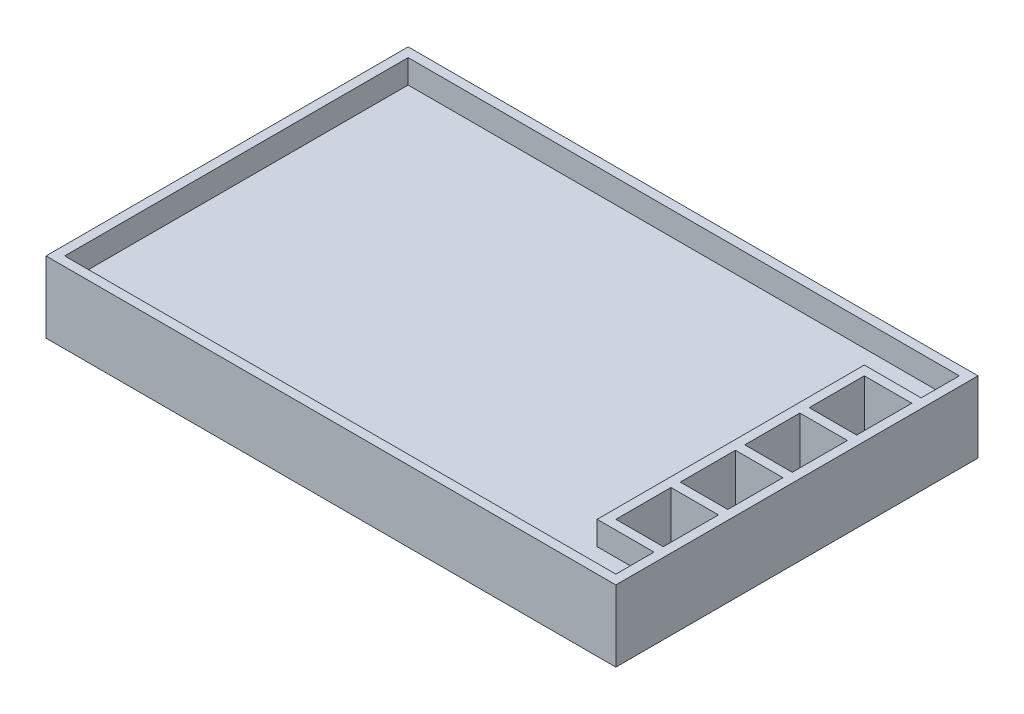
ISO-10303-21;
HEADER;
FILE_DESCRIPTION(('STEP AP214'),'2;1');
FILE_NAME('part.step','',(''),(''),'','','');
FILE_SCHEMA(('AUTOMOTIVE_DESIGN { 1 0 10303 214 1 1 1 1 }'));
ENDSEC;
DATA;
#1=APPLICATION_CONTEXT('core data for automotive mechanical design processes');
#2=APPLICATION_PROTOCOL_DEFINITION('international standard','automotive_design',2000,#1);
#3=PRODUCT_CONTEXT('',#1,'mechanical');
#4=PRODUCT('Part','Part','',(#3));
#5=PRODUCT_RELATED_PRODUCT_CATEGORY('part','',(#4));
#6=PRODUCT_DEFINITION_FORMATION('','',#4);
#7=PRODUCT_DEFINITION_CONTEXT('part definition',#1,'design');
#8=PRODUCT_DEFINITION('design','',#6,#7);
#9=PRODUCT_DEFINITION_SHAPE('','',#8);
#10=(LENGTH_UNIT() NAMED_UNIT(*) SI_UNIT(.MILLI.,.METRE.));
#11=(NAMED_UNIT(*) PLANE_ANGLE_UNIT() SI_UNIT($,.RADIAN.));
#12=(NAMED_UNIT(*) SI_UNIT($,.STERADIAN.) SOLID_ANGLE_UNIT());
#13=UNCERTAINTY_MEASURE_WITH_UNIT(LENGTH_MEASURE(1.E-05),#10,'distance_accuracy_value','');
#14=(GEOMETRIC_REPRESENTATION_CONTEXT(3) GLOBAL_UNCERTAINTY_ASSIGNED_CONTEXT((#13)) GLOBAL_UNIT_ASSIGNED_CONTEXT((#10,
#11,#12)) REPRESENTATION_CONTEXT('',''));
#15=CARTESIAN_POINT('',(0.,0.,0.));
#16=DIRECTION('',(0.,0.,1.));
#17=DIRECTION('',(1.,0.,0.));
#18=AXIS2_PLACEMENT_3D('',#15,#16,#17);
#19=CARTESIAN_POINT('',(327.157180973326,-745.502036847453,-258.416472916478));
#20=DIRECTION('',(1.,0.,0.));
#21=DIRECTION('',(0.,0.,-1.));
#22=AXIS2_PLACEMENT_3D('',#19,#20,#21);
#23=PLANE('',#22);
#24=DIRECTION('',(0.,-1.,0.));
#25=VECTOR('',#24,1.);
#26=CARTESIAN_POINT('',(327.157180973326,292.195619405904,-217.616472916478));
#27=LINE('',#26,#25);
#28=CARTESIAN_POINT('',(327.157180973326,0.,-217.616472916478));
#29=VERTEX_POINT('',#28);
#30=CARTESIAN_POINT('',(327.157180973326,-25.4,-217.616472916478));
#31=VERTEX_POINT('',#30);
#32=EDGE_CURVE('E306',#29,#31,#27,.T.);
#33=ORIENTED_EDGE('',*,*,#32,.F.);
#34=DIRECTION('',(0.,0.,-1.));
#35=VECTOR('',#34,1.);
#36=CARTESIAN_POINT('',(327.157180973326,0.,-258.416472916478));
#37=LINE('',#36,#35);
#38=CARTESIAN_POINT('',(327.157180973326,0.,-258.416472916478));
#39=VERTEX_POINT('',#38);
#40=EDGE_CURVE('E393',#29,#39,#37,.T.);
#41=ORIENTED_EDGE('',*,*,#40,.T.);
#42=DIRECTION('',(0.,1.,0.));
#43=VECTOR('',#42,1.);
#44=CARTESIAN_POINT('',(327.157180973326,-745.502036847453,-258.416472916478));
#45=LINE('',#44,#43);
#46=CARTESIAN_POINT('',(327.157180973326,-25.4,-258.416472916478));
#47=VERTEX_POINT('',#46);
#48=EDGE_CURVE('E410',#47,#39,#45,.T.);
#49=ORIENTED_EDGE('',*,*,#48,.F.);
#50=DIRECTION('',(0.,0.,1.));
#51=VECTOR('',#50,1.);
#52=CARTESIAN_POINT('',(327.157180973326,-25.4,-258.416472916478));
#53=LINE('',#52,#51);
#54=EDGE_CURVE('E375',#47,#31,#53,.T.);
#55=ORIENTED_EDGE('',*,*,#54,.T.);
#56=EDGE_LOOP('',(#33,#41,#49,#55));
#57=FACE_BOUND('',#56,.T.);
#58=ADVANCED_FACE('F38',(#57),#23,.F.);
#59=DIRECTION('',(0.,-1.,0.));
#60=VECTOR('',#59,1.);
#61=CARTESIAN_POINT('',(327.157180973326,292.195619405904,68.1835270835218));
#62=LINE('',#61,#60);
#63=CARTESIAN_POINT('',(327.157180973326,0.,68.1835270835218));
#64=VERTEX_POINT('',#63);
#65=CARTESIAN_POINT('',(327.157180973326,-25.4,68.1835270835218));
#66=VERTEX_POINT('',#65);
#67=EDGE_CURVE('E256',#64,#66,#62,.T.);
#68=ORIENTED_EDGE('',*,*,#67,.T.);
#69=CARTESIAN_POINT('',(327.157180973326,-25.4,108.983527083522));
#70=VERTEX_POINT('',#69);
#71=EDGE_CURVE('E42',#66,#70,#53,.T.);
#72=ORIENTED_EDGE('',*,*,#71,.T.);
#73=DIRECTION('',(0.,1.,0.));
#74=VECTOR('',#73,1.);
#75=CARTESIAN_POINT('',(327.157180973326,-745.502036847453,108.983527083522));
#76=LINE('',#75,#74);
#77=CARTESIAN_POINT('',(327.157180973326,0.,108.983527083522));
#78=VERTEX_POINT('',#77);
#79=EDGE_CURVE('E413',#70,#78,#76,.T.);
#80=ORIENTED_EDGE('',*,*,#79,.T.);
#81=EDGE_CURVE('E398',#78,#64,#37,.T.);
#82=ORIENTED_EDGE('',*,*,#81,.T.);
#83=EDGE_LOOP('',(#68,#72,#80,#82));
#84=FACE_BOUND('',#83,.T.);
#85=ADVANCED_FACE('F462',(#84),#23,.F.);
#86=DIRECTION('',(0.,1.,0.));
#87=VECTOR('',#86,1.);
#88=CARTESIAN_POINT('',(327.157180973326,-154.018651363282,58.1835270835218));
#89=LINE('',#88,#87);
#90=CARTESIAN_POINT('',(327.157180973326,-61.2,58.1835270835218));
#91=VERTEX_POINT('',#90);
#92=CARTESIAN_POINT('',(327.157180973326,0.,58.1835270835217));
#93=VERTEX_POINT('',#92);
#94=EDGE_CURVE('E319',#91,#93,#89,.T.);
#95=ORIENTED_EDGE('',*,*,#94,.T.);
#96=CARTESIAN_POINT('',(327.157180973326,0.,-0.766472916478245));
#97=VERTEX_POINT('',#96);
#98=EDGE_CURVE('E403',#93,#97,#37,.T.);
#99=ORIENTED_EDGE('',*,*,#98,.T.);
#100=DIRECTION('',(0.,1.,0.));
#101=VECTOR('',#100,1.);
#102=CARTESIAN_POINT('',(327.157180973326,-154.018651363282,-0.766472916478259));
#103=LINE('',#102,#101);
#104=CARTESIAN_POINT('',(327.157180973326,-61.2,-0.766472916478259));
#105=VERTEX_POINT('',#104);
#106=EDGE_CURVE('E262',#105,#97,#103,.T.);
#107=ORIENTED_EDGE('',*,*,#106,.F.);
#108=DIRECTION('',(0.,0.,1.));
#109=VECTOR('',#108,1.);
#110=CARTESIAN_POINT('',(327.157180973326,-61.2,-0.766472916478259));
#111=LINE('',#110,#109);
#112=EDGE_CURVE('E321',#105,#91,#111,.T.);
#113=ORIENTED_EDGE('',*,*,#112,.T.);
#114=EDGE_LOOP('',(#95,#99,#107,#113));
#115=FACE_BOUND('',#114,.T.);
#116=ADVANCED_FACE('F468',(#115),#23,.F.);
#117=DIRECTION('',(0.,1.,0.));
#118=VECTOR('',#117,1.);
#119=CARTESIAN_POINT('',(327.157180973326,-154.018651363282,-10.7664729164783));
#120=LINE('',#119,#118);
#121=CARTESIAN_POINT('',(327.157180973326,-61.2,-10.7664729164783));
#122=VERTEX_POINT('',#121);
#123=CARTESIAN_POINT('',(327.157180973326,0.,-10.7664729164783));
#124=VERTEX_POINT('',#123);
#125=EDGE_CURVE('E333',#122,#124,#120,.T.);
#126=ORIENTED_EDGE('',*,*,#125,.T.);
#127=CARTESIAN_POINT('',(327.157180973326,0.,-69.7164729164783));
#128=VERTEX_POINT('',#127);
#129=EDGE_CURVE('E396',#124,#128,#37,.T.);
#130=ORIENTED_EDGE('',*,*,#129,.T.);
#131=DIRECTION('',(0.,1.,0.));
#132=VECTOR('',#131,1.);
#133=CARTESIAN_POINT('',(327.157180973326,-154.018651363282,-69.7164729164783));
#134=LINE('',#133,#132);
#135=CARTESIAN_POINT('',(327.157180973326,-61.2,-69.7164729164783));
#136=VERTEX_POINT('',#135);
#137=EDGE_CURVE('E329',#136,#128,#134,.T.);
#138=ORIENTED_EDGE('',*,*,#137,.F.);
#139=DIRECTION('',(0.,0.,1.));
#140=VECTOR('',#139,1.);
#141=CARTESIAN_POINT('',(327.157180973326,-61.2,-69.7164729164783));
#142=LINE('',#141,#140);
#143=EDGE_CURVE('E335',#136,#122,#142,.T.);
#144=ORIENTED_EDGE('',*,*,#143,.T.);
#145=EDGE_LOOP('',(#126,#130,#138,#144));
#146=FACE_BOUND('',#145,.T.);
#147=ADVANCED_FACE('F482',(#146),#23,.F.);
#148=DIRECTION('',(0.,1.,0.));
#149=VECTOR('',#148,1.);
#150=CARTESIAN_POINT('',(327.157180973326,-154.018651363282,-79.7164729164783));
#151=LINE('',#150,#149);
#152=CARTESIAN_POINT('',(327.157180973326,-61.2,-79.7164729164783));
#153=VERTEX_POINT('',#152);
#154=CARTESIAN_POINT('',(327.157180973326,0.,-79.7164729164783));
#155=VERTEX_POINT('',#154);
#156=EDGE_CURVE('E349',#153,#155,#151,.T.);
#157=ORIENTED_EDGE('',*,*,#156,.T.);
#158=CARTESIAN_POINT('',(327.157180973326,0.,-138.666472916478));
#159=VERTEX_POINT('',#158);
#160=EDGE_CURVE('E392',#155,#159,#37,.T.);
#161=ORIENTED_EDGE('',*,*,#160,.T.);
#162=DIRECTION('',(0.,1.,0.));
#163=VECTOR('',#162,1.);
#164=CARTESIAN_POINT('',(327.157180973326,-154.018651363282,-138.666472916478));
#165=LINE('',#164,#163);
#166=CARTESIAN_POINT('',(327.157180973326,-61.2,-138.666472916478));
#167=VERTEX_POINT('',#166);
#168=EDGE_CURVE('E345',#167,#159,#165,.T.);
#169=ORIENTED_EDGE('',*,*,#168,.F.);
#170=DIRECTION('',(0.,0.,1.));
#171=VECTOR('',#170,1.);
#172=CARTESIAN_POINT('',(327.157180973326,-61.2,-138.666472916478));
#173=LINE('',#172,#171);
#174=EDGE_CURVE('E351',#167,#153,#173,.T.);
#175=ORIENTED_EDGE('',*,*,#174,.T.);
#176=EDGE_LOOP('',(#157,#161,#169,#175));
#177=FACE_BOUND('',#176,.T.);
#178=ADVANCED_FACE('F475',(#177),#23,.F.);
#179=DIRECTION('',(0.,1.,0.));
#180=VECTOR('',#179,1.);
#181=CARTESIAN_POINT('',(327.157180973326,-154.018651363282,-148.666472916478));
#182=LINE('',#181,#180);
#183=CARTESIAN_POINT('',(327.157180973326,-61.2,-148.666472916478));
#184=VERTEX_POINT('',#183);
#185=CARTESIAN_POINT('',(327.157180973326,0.,-148.666472916478));
#186=VERTEX_POINT('',#185);
#187=EDGE_CURVE('E363',#184,#186,#182,.T.);
#188=ORIENTED_EDGE('',*,*,#187,.T.);
#189=CARTESIAN_POINT('',(327.157180973326,0.,-207.616472916478));
#190=VERTEX_POINT('',#189);
#191=EDGE_CURVE('E387',#186,#190,#37,.T.);
#192=ORIENTED_EDGE('',*,*,#191,.T.);
#193=DIRECTION('',(0.,1.,0.));
#194=VECTOR('',#193,1.);
#195=CARTESIAN_POINT('',(327.157180973326,-154.018651363282,-207.616472916478));
#196=LINE('',#195,#194);
#197=CARTESIAN_POINT('',(327.157180973326,-61.2,-207.616472916478));
#198=VERTEX_POINT('',#197);
#199=EDGE_CURVE('E246',#198,#190,#196,.T.);
#200=ORIENTED_EDGE('',*,*,#199,.F.);
#201=DIRECTION('',(0.,0.,1.));
#202=VECTOR('',#201,1.);
#203=CARTESIAN_POINT('',(327.157180973326,-61.2,-207.616472916478));
#204=LINE('',#203,#202);
#205=EDGE_CURVE('E365',#198,#184,#204,.T.);
#206=ORIENTED_EDGE('',*,*,#205,.T.);
#207=EDGE_LOOP('',(#188,#192,#200,#206));
#208=FACE_BOUND('',#207,.T.);
#209=ADVANCED_FACE('F386',(#208),#23,.F.);
#210=CARTESIAN_POINT('',(0.,-25.4,0.));
#211=DIRECTION('',(0.,1.,0.));
#212=DIRECTION('',(0.,0.,1.));
#213=AXIS2_PLACEMENT_3D('',#210,#211,#212);
#214=PLANE('',#213);
#215=DIRECTION('',(0.,0.,1.));
#216=VECTOR('',#215,1.);
#217=CARTESIAN_POINT('',(266.357180973326,-25.4,-217.616472916478));
#218=LINE('',#217,#216);
#219=CARTESIAN_POINT('',(266.357180973326,-25.4,-217.616472916478));
#220=VERTEX_POINT('',#219);
#221=CARTESIAN_POINT('',(266.357180973326,-25.4,68.1835270835218));
#222=VERTEX_POINT('',#221);
#223=EDGE_CURVE('E310',#220,#222,#218,.T.);
#224=ORIENTED_EDGE('',*,*,#223,.F.);
#225=DIRECTION('',(-1.,0.,0.));
#226=VECTOR('',#225,1.);
#227=CARTESIAN_POINT('',(327.157180973326,-25.4,-217.616472916478));
#228=LINE('',#227,#226);
#229=EDGE_CURVE('E269',#31,#220,#228,.T.);
#230=ORIENTED_EDGE('',*,*,#229,.F.);
#231=ORIENTED_EDGE('',*,*,#54,.F.);
#232=DIRECTION('',(1.,0.,0.));
#233=VECTOR('',#232,1.);
#234=CARTESIAN_POINT('',(-262.442819026674,-25.4,-258.416472916478));
#235=LINE('',#234,#233);
#236=CARTESIAN_POINT('',(-262.442819026674,-25.4,-258.416472916478));
#237=VERTEX_POINT('',#236);
#238=EDGE_CURVE('E371',#237,#47,#235,.T.);
#239=ORIENTED_EDGE('',*,*,#238,.F.);
#240=DIRECTION('',(0.,0.,-1.));
#241=VECTOR('',#240,1.);
#242=CARTESIAN_POINT('',(-262.442819026674,-25.4,-258.416472916478));
#243=LINE('',#242,#241);
#244=CARTESIAN_POINT('',(-262.442819026674,-25.4,108.983527083522));
#245=VERTEX_POINT('',#244);
#246=EDGE_CURVE('E419',#245,#237,#243,.T.);
#247=ORIENTED_EDGE('',*,*,#246,.F.);
#248=DIRECTION('',(-1.,0.,0.));
#249=VECTOR('',#248,1.);
#250=CARTESIAN_POINT('',(-262.442819026674,-25.4,108.983527083522));
#251=LINE('',#250,#249);
#252=EDGE_CURVE('E416',#70,#245,#251,.T.);
#253=ORIENTED_EDGE('',*,*,#252,.F.);
#254=ORIENTED_EDGE('',*,*,#71,.F.);
#255=DIRECTION('',(1.,0.,0.));
#256=VECTOR('',#255,1.);
#257=CARTESIAN_POINT('',(266.357180973326,-25.4,68.1835270835218));
#258=LINE('',#257,#256);
#259=EDGE_CURVE('E313',#222,#66,#258,.T.);
#260=ORIENTED_EDGE('',*,*,#259,.F.);
#261=EDGE_LOOP('',(#224,#230,#231,#239,#247,#253,#254,#260));
#262=FACE_BOUND('',#261,.T.);
#263=ADVANCED_FACE('F474',(#262),#214,.T.);
#264=CARTESIAN_POINT('',(-272.442819026674,-76.2,-268.416472916478));
#265=DIRECTION('',(-1.,0.,0.));
#266=DIRECTION('',(0.,0.,1.));
#267=AXIS2_PLACEMENT_3D('',#264,#265,#266);
#268=PLANE('',#267);
#269=DIRECTION('',(0.,0.,1.));
#270=VECTOR('',#269,1.);
#271=CARTESIAN_POINT('',(-272.442819026674,0.,-268.416472916478));
#272=LINE('',#271,#270);
#273=CARTESIAN_POINT('',(-272.442819026674,0.,-268.416472916478));
#274=VERTEX_POINT('',#273);
#275=CARTESIAN_POINT('',(-272.442819026674,0.,118.983527083522));
#276=VERTEX_POINT('',#275);
#277=EDGE_CURVE('E418',#274,#276,#272,.T.);
#278=ORIENTED_EDGE('',*,*,#277,.F.);
#279=DIRECTION('',(0.,1.,0.));
#280=VECTOR('',#279,1.);
#281=CARTESIAN_POINT('',(-272.442819026674,-76.2,-268.416472916478));
#282=LINE('',#281,#280);
#283=CARTESIAN_POINT('',(-272.442819026674,-76.2,-268.416472916478));
#284=VERTEX_POINT('',#283);
#285=EDGE_CURVE('E12',#284,#274,#282,.T.);
#286=ORIENTED_EDGE('',*,*,#285,.F.);
#287=DIRECTION('',(0.,0.,1.));
#288=VECTOR('',#287,1.);
#289=CARTESIAN_POINT('',(-272.442819026674,-76.2,-268.416472916478));
#290=LINE('',#289,#288);
#291=CARTESIAN_POINT('',(-272.442819026674,-76.2,118.983527083522));
#292=VERTEX_POINT('',#291);
#293=EDGE_CURVE('E420',#284,#292,#290,.T.);
#294=ORIENTED_EDGE('',*,*,#293,.T.);
#295=DIRECTION('',(0.,1.,0.));
#296=VECTOR('',#295,1.);
#297=CARTESIAN_POINT('',(-272.442819026674,-76.2,118.983527083522));
#298=LINE('',#297,#296);
#299=EDGE_CURVE('E89',#292,#276,#298,.T.);
#300=ORIENTED_EDGE('',*,*,#299,.T.);
#301=EDGE_LOOP('',(#278,#286,#294,#300));
#302=FACE_BOUND('',#301,.T.);
#303=ADVANCED_FACE('F40',(#302),#268,.T.);
#304=CARTESIAN_POINT('',(-272.442819026674,-76.2,-268.416472916478));
#305=DIRECTION('',(0.,0.,-1.));
#306=DIRECTION('',(-1.,0.,0.));
#307=AXIS2_PLACEMENT_3D('',#304,#305,#306);
#308=PLANE('',#307);
#309=DIRECTION('',(-1.,0.,0.));
#310=VECTOR('',#309,1.);
#311=CARTESIAN_POINT('',(-272.442819026674,0.,-268.416472916478));
#312=LINE('',#311,#310);
#313=CARTESIAN_POINT('',(337.157180973326,0.,-268.416472916478));
#314=VERTEX_POINT('',#313);
#315=EDGE_CURVE('E423',#314,#274,#312,.T.);
#316=ORIENTED_EDGE('',*,*,#315,.F.);
#317=DIRECTION('',(0.,1.,0.));
#318=VECTOR('',#317,1.);
#319=CARTESIAN_POINT('',(337.157180973326,-76.2,-268.416472916478));
#320=LINE('',#319,#318);
#321=CARTESIAN_POINT('',(337.157180973326,-76.2,-268.416472916478));
#322=VERTEX_POINT('',#321);
#323=EDGE_CURVE('E48',#322,#314,#320,.T.);
#324=ORIENTED_EDGE('',*,*,#323,.F.);
#325=DIRECTION('',(-1.,0.,0.));
#326=VECTOR('',#325,1.);
#327=CARTESIAN_POINT('',(-272.442819026674,-76.2,-268.416472916478));
#328=LINE('',#327,#326);
#329=EDGE_CURVE('E428',#322,#284,#328,.T.);
#330=ORIENTED_EDGE('',*,*,#329,.T.);
#331=ORIENTED_EDGE('',*,*,#285,.T.);
#332=EDGE_LOOP('',(#316,#324,#330,#331));
#333=FACE_BOUND('',#332,.T.);
#334=ADVANCED_FACE('F444',(#333),#308,.T.);
#335=CARTESIAN_POINT('',(337.157180973326,-76.2,-268.416472916478));
#336=DIRECTION('',(1.,0.,0.));
#337=DIRECTION('',(0.,0.,-1.));
#338=AXIS2_PLACEMENT_3D('',#335,#336,#337);
#339=PLANE('',#338);
#340=DIRECTION('',(0.,0.,-1.));
#341=VECTOR('',#340,1.);
#342=CARTESIAN_POINT('',(337.157180973326,0.,-268.416472916478));
#343=LINE('',#342,#341);
#344=CARTESIAN_POINT('',(337.157180973326,0.,118.983527083522));
#345=VERTEX_POINT('',#344);
#346=EDGE_CURVE('E435',#345,#314,#343,.T.);
#347=ORIENTED_EDGE('',*,*,#346,.F.);
#348=DIRECTION('',(0.,1.,0.));
#349=VECTOR('',#348,1.);
#350=CARTESIAN_POINT('',(337.157180973326,-76.2,118.983527083522));
#351=LINE('',#350,#349);
#352=CARTESIAN_POINT('',(337.157180973326,-76.2,118.983527083522));
#353=VERTEX_POINT('',#352);
#354=EDGE_CURVE('E440',#353,#345,#351,.T.);
#355=ORIENTED_EDGE('',*,*,#354,.F.);
#356=DIRECTION('',(0.,0.,-1.));
#357=VECTOR('',#356,1.);
#358=CARTESIAN_POINT('',(337.157180973326,-76.2,-268.416472916478));
#359=LINE('',#358,#357);
#360=EDGE_CURVE('E425',#353,#322,#359,.T.);
#361=ORIENTED_EDGE('',*,*,#360,.T.);
#362=ORIENTED_EDGE('',*,*,#323,.T.);
#363=EDGE_LOOP('',(#347,#355,#361,#362));
#364=FACE_BOUND('',#363,.T.);
#365=ADVANCED_FACE('F448',(#364),#339,.T.);
#366=CARTESIAN_POINT('',(-272.442819026674,-76.2,118.983527083522));
#367=DIRECTION('',(0.,0.,1.));
#368=DIRECTION('',(1.,0.,0.));
#369=AXIS2_PLACEMENT_3D('',#366,#367,#368);
#370=PLANE('',#369);
#371=DIRECTION('',(1.,0.,0.));
#372=VECTOR('',#371,1.);
#373=CARTESIAN_POINT('',(-272.442819026674,0.,118.983527083522));
#374=LINE('',#373,#372);
#375=EDGE_CURVE('E432',#276,#345,#374,.T.);
#376=ORIENTED_EDGE('',*,*,#375,.F.);
#377=ORIENTED_EDGE('',*,*,#299,.F.);
#378=DIRECTION('',(1.,0.,0.));
#379=VECTOR('',#378,1.);
#380=CARTESIAN_POINT('',(-272.442819026674,-76.2,118.983527083522));
#381=LINE('',#380,#379);
#382=EDGE_CURVE('E422',#292,#353,#381,.T.);
#383=ORIENTED_EDGE('',*,*,#382,.T.);
#384=ORIENTED_EDGE('',*,*,#354,.T.);
#385=EDGE_LOOP('',(#376,#377,#383,#384));
#386=FACE_BOUND('',#385,.T.);
#387=ADVANCED_FACE('F442',(#386),#370,.T.);
#388=CARTESIAN_POINT('',(0.,-76.2,0.));
#389=DIRECTION('',(0.,1.,0.));
#390=DIRECTION('',(0.,0.,1.));
#391=AXIS2_PLACEMENT_3D('',#388,#389,#390);
#392=PLANE('',#391);
#393=ORIENTED_EDGE('',*,*,#293,.F.);
#394=ORIENTED_EDGE('',*,*,#329,.F.);
#395=ORIENTED_EDGE('',*,*,#360,.F.);
#396=ORIENTED_EDGE('',*,*,#382,.F.);
#397=EDGE_LOOP('',(#393,#394,#395,#396));
#398=FACE_BOUND('',#397,.T.);
#399=ADVANCED_FACE('F450',(#398),#392,.F.);
#400=CARTESIAN_POINT('',(0.,0.,0.));
#401=DIRECTION('',(0.,1.,0.));
#402=DIRECTION('',(0.,0.,1.));
#403=AXIS2_PLACEMENT_3D('',#400,#401,#402);
#404=PLANE('',#403);
#405=ORIENTED_EDGE('',*,*,#40,.F.);
#406=DIRECTION('',(-1.,0.,0.));
#407=VECTOR('',#406,1.);
#408=CARTESIAN_POINT('',(327.157180973326,0.,-217.616472916478));
#409=LINE('',#408,#407);
#410=CARTESIAN_POINT('',(266.357180973326,0.,-217.616472916478));
#411=VERTEX_POINT('',#410);
#412=EDGE_CURVE('E255',#29,#411,#409,.T.);
#413=ORIENTED_EDGE('',*,*,#412,.T.);
#414=DIRECTION('',(0.,0.,1.));
#415=VECTOR('',#414,1.);
#416=CARTESIAN_POINT('',(266.357180973326,0.,-217.616472916478));
#417=LINE('',#416,#415);
#418=CARTESIAN_POINT('',(266.357180973326,0.,68.1835270835218));
#419=VERTEX_POINT('',#418);
#420=EDGE_CURVE('E301',#411,#419,#417,.T.);
#421=ORIENTED_EDGE('',*,*,#420,.T.);
#422=DIRECTION('',(1.,0.,0.));
#423=VECTOR('',#422,1.);
#424=CARTESIAN_POINT('',(266.357180973326,0.,68.1835270835218));
#425=LINE('',#424,#423);
#426=EDGE_CURVE('E298',#419,#64,#425,.T.);
#427=ORIENTED_EDGE('',*,*,#426,.T.);
#428=ORIENTED_EDGE('',*,*,#81,.F.);
#429=DIRECTION('',(1.,0.,0.));
#430=VECTOR('',#429,1.);
#431=CARTESIAN_POINT('',(-262.442819026674,0.,108.983527083522));
#432=LINE('',#431,#430);
#433=CARTESIAN_POINT('',(-262.442819026674,0.,108.983527083522));
#434=VERTEX_POINT('',#433);
#435=EDGE_CURVE('E397',#434,#78,#432,.T.);
#436=ORIENTED_EDGE('',*,*,#435,.F.);
#437=DIRECTION('',(0.,0.,1.));
#438=VECTOR('',#437,1.);
#439=CARTESIAN_POINT('',(-262.442819026674,0.,-258.416472916478));
#440=LINE('',#439,#438);
#441=CARTESIAN_POINT('',(-262.442819026674,0.,-258.416472916478));
#442=VERTEX_POINT('',#441);
#443=EDGE_CURVE('E56',#442,#434,#440,.T.);
#444=ORIENTED_EDGE('',*,*,#443,.F.);
#445=DIRECTION('',(-1.,0.,0.));
#446=VECTOR('',#445,1.);
#447=CARTESIAN_POINT('',(-262.442819026674,0.,-258.416472916478));
#448=LINE('',#447,#446);
#449=EDGE_CURVE('E402',#39,#442,#448,.T.);
#450=ORIENTED_EDGE('',*,*,#449,.F.);
#451=EDGE_LOOP('',(#405,#413,#421,#427,#428,#436,#444,#450));
#452=FACE_BOUND('',#451,.T.);
#453=ORIENTED_EDGE('',*,*,#191,.F.);
#454=DIRECTION('',(-1.,0.,0.));
#455=VECTOR('',#454,1.);
#456=CARTESIAN_POINT('',(327.157180973326,0.,-148.666472916478));
#457=LINE('',#456,#455);
#458=CARTESIAN_POINT('',(276.357180973326,0.,-148.666472916478));
#459=VERTEX_POINT('',#458);
#460=EDGE_CURVE('E261',#186,#459,#457,.T.);
#461=ORIENTED_EDGE('',*,*,#460,.T.);
#462=DIRECTION('',(0.,0.,-1.));
#463=VECTOR('',#462,1.);
#464=CARTESIAN_POINT('',(276.357180973326,0.,-148.666472916478));
#465=LINE('',#464,#463);
#466=CARTESIAN_POINT('',(276.357180973326,0.,-207.616472916478));
#467=VERTEX_POINT('',#466);
#468=EDGE_CURVE('E239',#459,#467,#465,.T.);
#469=ORIENTED_EDGE('',*,*,#468,.T.);
#470=DIRECTION('',(1.,0.,0.));
#471=VECTOR('',#470,1.);
#472=CARTESIAN_POINT('',(276.357180973326,0.,-207.616472916478));
#473=LINE('',#472,#471);
#474=EDGE_CURVE('E249',#467,#190,#473,.T.);
#475=ORIENTED_EDGE('',*,*,#474,.T.);
#476=EDGE_LOOP('',(#453,#461,#469,#475));
#477=FACE_BOUND('',#476,.T.);
#478=ORIENTED_EDGE('',*,*,#160,.F.);
#479=DIRECTION('',(-1.,0.,0.));
#480=VECTOR('',#479,1.);
#481=CARTESIAN_POINT('',(327.157180973326,0.,-79.7164729164783));
#482=LINE('',#481,#480);
#483=CARTESIAN_POINT('',(276.357180973326,0.,-79.7164729164783));
#484=VERTEX_POINT('',#483);
#485=EDGE_CURVE('E277',#155,#484,#482,.T.);
#486=ORIENTED_EDGE('',*,*,#485,.T.);
#487=DIRECTION('',(0.,0.,-1.));
#488=VECTOR('',#487,1.);
#489=CARTESIAN_POINT('',(276.357180973326,0.,-79.7164729164783));
#490=LINE('',#489,#488);
#491=CARTESIAN_POINT('',(276.357180973326,0.,-138.666472916478));
#492=VERTEX_POINT('',#491);
#493=EDGE_CURVE('E274',#484,#492,#490,.T.);
#494=ORIENTED_EDGE('',*,*,#493,.T.);
#495=DIRECTION('',(1.,0.,0.));
#496=VECTOR('',#495,1.);
#497=CARTESIAN_POINT('',(276.357180973326,0.,-138.666472916478));
#498=LINE('',#497,#496);
#499=EDGE_CURVE('E266',#492,#159,#498,.T.);
#500=ORIENTED_EDGE('',*,*,#499,.T.);
#501=EDGE_LOOP('',(#478,#486,#494,#500));
#502=FACE_BOUND('',#501,.T.);
#503=ORIENTED_EDGE('',*,*,#129,.F.);
#504=DIRECTION('',(-1.,0.,0.));
#505=VECTOR('',#504,1.);
#506=CARTESIAN_POINT('',(327.157180973326,0.,-10.7664729164783));
#507=LINE('',#506,#505);
#508=CARTESIAN_POINT('',(276.357180973326,0.,-10.7664729164783));
#509=VERTEX_POINT('',#508);
#510=EDGE_CURVE('E286',#124,#509,#507,.T.);
#511=ORIENTED_EDGE('',*,*,#510,.T.);
#512=DIRECTION('',(0.,0.,-1.));
#513=VECTOR('',#512,1.);
#514=CARTESIAN_POINT('',(276.357180973326,0.,-10.7664729164783));
#515=LINE('',#514,#513);
#516=CARTESIAN_POINT('',(276.357180973326,0.,-69.7164729164783));
#517=VERTEX_POINT('',#516);
#518=EDGE_CURVE('E283',#509,#517,#515,.T.);
#519=ORIENTED_EDGE('',*,*,#518,.T.);
#520=DIRECTION('',(1.,0.,0.));
#521=VECTOR('',#520,1.);
#522=CARTESIAN_POINT('',(276.357180973326,0.,-69.7164729164783));
#523=LINE('',#522,#521);
#524=EDGE_CURVE('E280',#517,#128,#523,.T.);
#525=ORIENTED_EDGE('',*,*,#524,.T.);
#526=EDGE_LOOP('',(#503,#511,#519,#525));
#527=FACE_BOUND('',#526,.T.);
#528=DIRECTION('',(1.,0.,0.));
#529=VECTOR('',#528,1.);
#530=CARTESIAN_POINT('',(276.357180973326,0.,-0.766472916478254));
#531=LINE('',#530,#529);
#532=CARTESIAN_POINT('',(276.357180973326,0.,-0.766472916478254));
#533=VERTEX_POINT('',#532);
#534=EDGE_CURVE('E289',#533,#97,#531,.T.);
#535=ORIENTED_EDGE('',*,*,#534,.T.);
#536=ORIENTED_EDGE('',*,*,#98,.F.);
#537=DIRECTION('',(-1.,0.,0.));
#538=VECTOR('',#537,1.);
#539=CARTESIAN_POINT('',(327.157180973326,0.,58.1835270835217));
#540=LINE('',#539,#538);
#541=CARTESIAN_POINT('',(276.357180973326,0.,58.1835270835217));
#542=VERTEX_POINT('',#541);
#543=EDGE_CURVE('E295',#93,#542,#540,.T.);
#544=ORIENTED_EDGE('',*,*,#543,.T.);
#545=DIRECTION('',(0.,0.,-1.));
#546=VECTOR('',#545,1.);
#547=CARTESIAN_POINT('',(276.357180973326,0.,58.1835270835217));
#548=LINE('',#547,#546);
#549=EDGE_CURVE('E292',#542,#533,#548,.T.);
#550=ORIENTED_EDGE('',*,*,#549,.T.);
#551=EDGE_LOOP('',(#535,#536,#544,#550));
#552=FACE_BOUND('',#551,.T.);
#553=ORIENTED_EDGE('',*,*,#277,.T.);
#554=ORIENTED_EDGE('',*,*,#375,.T.);
#555=ORIENTED_EDGE('',*,*,#346,.T.);
#556=ORIENTED_EDGE('',*,*,#315,.T.);
#557=EDGE_LOOP('',(#553,#554,#555,#556));
#558=FACE_BOUND('',#557,.T.);
#559=ADVANCED_FACE('F258',(#452,#477,#502,#527,#552,#558),#404,.T.);
#560=CARTESIAN_POINT('',(-262.442819026674,-745.502036847453,-258.416472916478));
#561=DIRECTION('',(-1.,0.,0.));
#562=DIRECTION('',(0.,0.,1.));
#563=AXIS2_PLACEMENT_3D('',#560,#561,#562);
#564=PLANE('',#563);
#565=ORIENTED_EDGE('',*,*,#246,.T.);
#566=DIRECTION('',(0.,1.,0.));
#567=VECTOR('',#566,1.);
#568=CARTESIAN_POINT('',(-262.442819026674,-745.502036847453,-258.416472916478));
#569=LINE('',#568,#567);
#570=EDGE_CURVE('E408',#237,#442,#569,.T.);
#571=ORIENTED_EDGE('',*,*,#570,.T.);
#572=ORIENTED_EDGE('',*,*,#443,.T.);
#573=DIRECTION('',(0.,1.,0.));
#574=VECTOR('',#573,1.);
#575=CARTESIAN_POINT('',(-262.442819026674,-745.502036847453,108.983527083522));
#576=LINE('',#575,#574);
#577=EDGE_CURVE('E407',#245,#434,#576,.T.);
#578=ORIENTED_EDGE('',*,*,#577,.F.);
#579=EDGE_LOOP('',(#565,#571,#572,#578));
#580=FACE_BOUND('',#579,.T.);
#581=ADVANCED_FACE('F457',(#580),#564,.F.);
#582=CARTESIAN_POINT('',(-262.442819026674,-745.502036847453,-258.416472916478));
#583=DIRECTION('',(0.,0.,-1.));
#584=DIRECTION('',(-1.,0.,0.));
#585=AXIS2_PLACEMENT_3D('',#582,#583,#584);
#586=PLANE('',#585);
#587=ORIENTED_EDGE('',*,*,#238,.T.);
#588=ORIENTED_EDGE('',*,*,#48,.T.);
#589=ORIENTED_EDGE('',*,*,#449,.T.);
#590=ORIENTED_EDGE('',*,*,#570,.F.);
#591=EDGE_LOOP('',(#587,#588,#589,#590));
#592=FACE_BOUND('',#591,.T.);
#593=ADVANCED_FACE('F529',(#592),#586,.F.);
#594=CARTESIAN_POINT('',(-262.442819026674,-745.502036847453,108.983527083522));
#595=DIRECTION('',(0.,0.,1.));
#596=DIRECTION('',(1.,0.,0.));
#597=AXIS2_PLACEMENT_3D('',#594,#595,#596);
#598=PLANE('',#597);
#599=ORIENTED_EDGE('',*,*,#252,.T.);
#600=ORIENTED_EDGE('',*,*,#577,.T.);
#601=ORIENTED_EDGE('',*,*,#435,.T.);
#602=ORIENTED_EDGE('',*,*,#79,.F.);
#603=EDGE_LOOP('',(#599,#600,#601,#602));
#604=FACE_BOUND('',#603,.T.);
#605=ADVANCED_FACE('F525',(#604),#598,.F.);
#606=CARTESIAN_POINT('',(327.157180973326,-154.018651363282,-148.666472916478));
#607=DIRECTION('',(0.,0.,1.));
#608=DIRECTION('',(1.,0.,0.));
#609=AXIS2_PLACEMENT_3D('',#606,#607,#608);
#610=PLANE('',#609);
#611=DIRECTION('',(-1.,0.,0.));
#612=VECTOR('',#611,1.);
#613=CARTESIAN_POINT('',(327.157180973326,-61.2,-148.666472916478));
#614=LINE('',#613,#612);
#615=CARTESIAN_POINT('',(276.357180973326,-61.2,-148.666472916478));
#616=VERTEX_POINT('',#615);
#617=EDGE_CURVE('E362',#184,#616,#614,.T.);
#618=ORIENTED_EDGE('',*,*,#617,.T.);
#619=DIRECTION('',(0.,1.,0.));
#620=VECTOR('',#619,1.);
#621=CARTESIAN_POINT('',(276.357180973326,-154.018651363282,-148.666472916478));
#622=LINE('',#621,#620);
#623=EDGE_CURVE('E245',#616,#459,#622,.T.);
#624=ORIENTED_EDGE('',*,*,#623,.T.);
#625=ORIENTED_EDGE('',*,*,#460,.F.);
#626=ORIENTED_EDGE('',*,*,#187,.F.);
#627=EDGE_LOOP('',(#618,#624,#625,#626));
#628=FACE_BOUND('',#627,.T.);
#629=ADVANCED_FACE('F391',(#628),#610,.F.);
#630=CARTESIAN_POINT('',(276.357180973326,-154.018651363282,-207.616472916478));
#631=DIRECTION('',(-1.,0.,0.));
#632=DIRECTION('',(0.,0.,1.));
#633=AXIS2_PLACEMENT_3D('',#630,#631,#632);
#634=PLANE('',#633);
#635=DIRECTION('',(0.,0.,-1.));
#636=VECTOR('',#635,1.);
#637=CARTESIAN_POINT('',(276.357180973326,-61.2,-207.616472916478));
#638=LINE('',#637,#636);
#639=CARTESIAN_POINT('',(276.357180973326,-61.2,-207.616472916478));
#640=VERTEX_POINT('',#639);
#641=EDGE_CURVE('E242',#616,#640,#638,.T.);
#642=ORIENTED_EDGE('',*,*,#641,.T.);
#643=DIRECTION('',(0.,1.,0.));
#644=VECTOR('',#643,1.);
#645=CARTESIAN_POINT('',(276.357180973326,-154.018651363282,-207.616472916478));
#646=LINE('',#645,#644);
#647=EDGE_CURVE('E234',#640,#467,#646,.T.);
#648=ORIENTED_EDGE('',*,*,#647,.T.);
#649=ORIENTED_EDGE('',*,*,#468,.F.);
#650=ORIENTED_EDGE('',*,*,#623,.F.);
#651=EDGE_LOOP('',(#642,#648,#649,#650));
#652=FACE_BOUND('',#651,.T.);
#653=ADVANCED_FACE('F236',(#652),#634,.F.);
#654=CARTESIAN_POINT('',(327.157180973326,-154.018651363282,-207.616472916478));
#655=DIRECTION('',(0.,0.,-1.));
#656=DIRECTION('',(-1.,0.,0.));
#657=AXIS2_PLACEMENT_3D('',#654,#655,#656);
#658=PLANE('',#657);
#659=DIRECTION('',(1.,0.,0.));
#660=VECTOR('',#659,1.);
#661=CARTESIAN_POINT('',(327.157180973326,-61.2,-207.616472916478));
#662=LINE('',#661,#660);
#663=EDGE_CURVE('E367',#640,#198,#662,.T.);
#664=ORIENTED_EDGE('',*,*,#663,.T.);
#665=ORIENTED_EDGE('',*,*,#199,.T.);
#666=ORIENTED_EDGE('',*,*,#474,.F.);
#667=ORIENTED_EDGE('',*,*,#647,.F.);
#668=EDGE_LOOP('',(#664,#665,#666,#667));
#669=FACE_BOUND('',#668,.T.);
#670=ADVANCED_FACE('F250',(#669),#658,.F.);
#671=CARTESIAN_POINT('',(0.,-61.2,0.));
#672=DIRECTION('',(0.,1.,0.));
#673=DIRECTION('',(0.,0.,1.));
#674=AXIS2_PLACEMENT_3D('',#671,#672,#673);
#675=PLANE('',#674);
#676=ORIENTED_EDGE('',*,*,#205,.F.);
#677=ORIENTED_EDGE('',*,*,#663,.F.);
#678=ORIENTED_EDGE('',*,*,#641,.F.);
#679=ORIENTED_EDGE('',*,*,#617,.F.);
#680=EDGE_LOOP('',(#676,#677,#678,#679));
#681=FACE_BOUND('',#680,.T.);
#682=ADVANCED_FACE('F516',(#681),#675,.T.);
#683=CARTESIAN_POINT('',(327.157180973326,-154.018651363282,-79.7164729164783));
#684=DIRECTION('',(0.,0.,1.));
#685=DIRECTION('',(1.,0.,0.));
#686=AXIS2_PLACEMENT_3D('',#683,#684,#685);
#687=PLANE('',#686);
#688=DIRECTION('',(-1.,0.,0.));
#689=VECTOR('',#688,1.);
#690=CARTESIAN_POINT('',(327.157180973326,-61.2,-79.7164729164783));
#691=LINE('',#690,#689);
#692=CARTESIAN_POINT('',(276.357180973326,-61.2,-79.7164729164783));
#693=VERTEX_POINT('',#692);
#694=EDGE_CURVE('E348',#153,#693,#691,.T.);
#695=ORIENTED_EDGE('',*,*,#694,.T.);
#696=DIRECTION('',(0.,1.,0.));
#697=VECTOR('',#696,1.);
#698=CARTESIAN_POINT('',(276.357180973326,-154.018651363282,-79.7164729164783));
#699=LINE('',#698,#697);
#700=EDGE_CURVE('E355',#693,#484,#699,.T.);
#701=ORIENTED_EDGE('',*,*,#700,.T.);
#702=ORIENTED_EDGE('',*,*,#485,.F.);
#703=ORIENTED_EDGE('',*,*,#156,.F.);
#704=EDGE_LOOP('',(#695,#701,#702,#703));
#705=FACE_BOUND('',#704,.T.);
#706=ADVANCED_FACE('F495',(#705),#687,.F.);
#707=CARTESIAN_POINT('',(276.357180973326,-154.018651363282,-138.666472916478));
#708=DIRECTION('',(-1.,0.,0.));
#709=DIRECTION('',(0.,0.,1.));
#710=AXIS2_PLACEMENT_3D('',#707,#708,#709);
#711=PLANE('',#710);
#712=DIRECTION('',(0.,0.,-1.));
#713=VECTOR('',#712,1.);
#714=CARTESIAN_POINT('',(276.357180973326,-61.2,-138.666472916478));
#715=LINE('',#714,#713);
#716=CARTESIAN_POINT('',(276.357180973326,-61.2,-138.666472916478));
#717=VERTEX_POINT('',#716);
#718=EDGE_CURVE('E346',#693,#717,#715,.T.);
#719=ORIENTED_EDGE('',*,*,#718,.T.);
#720=DIRECTION('',(0.,1.,0.));
#721=VECTOR('',#720,1.);
#722=CARTESIAN_POINT('',(276.357180973326,-154.018651363282,-138.666472916478));
#723=LINE('',#722,#721);
#724=EDGE_CURVE('E357',#717,#492,#723,.T.);
#725=ORIENTED_EDGE('',*,*,#724,.T.);
#726=ORIENTED_EDGE('',*,*,#493,.F.);
#727=ORIENTED_EDGE('',*,*,#700,.F.);
#728=EDGE_LOOP('',(#719,#725,#726,#727));
#729=FACE_BOUND('',#728,.T.);
#730=ADVANCED_FACE('F508',(#729),#711,.F.);
#731=CARTESIAN_POINT('',(327.157180973326,-154.018651363282,-138.666472916478));
#732=DIRECTION('',(0.,0.,-1.));
#733=DIRECTION('',(-1.,0.,0.));
#734=AXIS2_PLACEMENT_3D('',#731,#732,#733);
#735=PLANE('',#734);
#736=DIRECTION('',(1.,0.,0.));
#737=VECTOR('',#736,1.);
#738=CARTESIAN_POINT('',(327.157180973326,-61.2,-138.666472916478));
#739=LINE('',#738,#737);
#740=EDGE_CURVE('E353',#717,#167,#739,.T.);
#741=ORIENTED_EDGE('',*,*,#740,.T.);
#742=ORIENTED_EDGE('',*,*,#168,.T.);
#743=ORIENTED_EDGE('',*,*,#499,.F.);
#744=ORIENTED_EDGE('',*,*,#724,.F.);
#745=EDGE_LOOP('',(#741,#742,#743,#744));
#746=FACE_BOUND('',#745,.T.);
#747=ADVANCED_FACE('F502',(#746),#735,.F.);
#748=CARTESIAN_POINT('',(0.,-61.2,0.));
#749=DIRECTION('',(0.,1.,0.));
#750=DIRECTION('',(0.,0.,1.));
#751=AXIS2_PLACEMENT_3D('',#748,#749,#750);
#752=PLANE('',#751);
#753=ORIENTED_EDGE('',*,*,#174,.F.);
#754=ORIENTED_EDGE('',*,*,#740,.F.);
#755=ORIENTED_EDGE('',*,*,#718,.F.);
#756=ORIENTED_EDGE('',*,*,#694,.F.);
#757=EDGE_LOOP('',(#753,#754,#755,#756));
#758=FACE_BOUND('',#757,.T.);
#759=ADVANCED_FACE('F506',(#758),#752,.T.);
#760=CARTESIAN_POINT('',(327.157180973326,-154.018651363282,-10.7664729164783));
#761=DIRECTION('',(0.,0.,1.));
#762=DIRECTION('',(1.,0.,0.));
#763=AXIS2_PLACEMENT_3D('',#760,#761,#762);
#764=PLANE('',#763);
#765=DIRECTION('',(-1.,0.,0.));
#766=VECTOR('',#765,1.);
#767=CARTESIAN_POINT('',(327.157180973326,-61.2,-10.7664729164783));
#768=LINE('',#767,#766);
#769=CARTESIAN_POINT('',(276.357180973326,-61.2,-10.7664729164783));
#770=VERTEX_POINT('',#769);
#771=EDGE_CURVE('E332',#122,#770,#768,.T.);
#772=ORIENTED_EDGE('',*,*,#771,.T.);
#773=DIRECTION('',(0.,1.,0.));
#774=VECTOR('',#773,1.);
#775=CARTESIAN_POINT('',(276.357180973326,-154.018651363282,-10.7664729164783));
#776=LINE('',#775,#774);
#777=EDGE_CURVE('E339',#770,#509,#776,.T.);
#778=ORIENTED_EDGE('',*,*,#777,.T.);
#779=ORIENTED_EDGE('',*,*,#510,.F.);
#780=ORIENTED_EDGE('',*,*,#125,.F.);
#781=EDGE_LOOP('',(#772,#778,#779,#780));
#782=FACE_BOUND('',#781,.T.);
#783=ADVANCED_FACE('F593',(#782),#764,.F.);
#784=CARTESIAN_POINT('',(276.357180973326,-154.018651363282,-69.7164729164783));
#785=DIRECTION('',(-1.,0.,0.));
#786=DIRECTION('',(0.,0.,1.));
#787=AXIS2_PLACEMENT_3D('',#784,#785,#786);
#788=PLANE('',#787);
#789=DIRECTION('',(0.,0.,-1.));
#790=VECTOR('',#789,1.);
#791=CARTESIAN_POINT('',(276.357180973326,-61.2,-69.7164729164783));
#792=LINE('',#791,#790);
#793=CARTESIAN_POINT('',(276.357180973326,-61.2,-69.7164729164783));
#794=VERTEX_POINT('',#793);
#795=EDGE_CURVE('E330',#770,#794,#792,.T.);
#796=ORIENTED_EDGE('',*,*,#795,.T.);
#797=DIRECTION('',(0.,1.,0.));
#798=VECTOR('',#797,1.);
#799=CARTESIAN_POINT('',(276.357180973326,-154.018651363282,-69.7164729164783));
#800=LINE('',#799,#798);
#801=EDGE_CURVE('E341',#794,#517,#800,.T.);
#802=ORIENTED_EDGE('',*,*,#801,.T.);
#803=ORIENTED_EDGE('',*,*,#518,.F.);
#804=ORIENTED_EDGE('',*,*,#777,.F.);
#805=EDGE_LOOP('',(#796,#802,#803,#804));
#806=FACE_BOUND('',#805,.T.);
#807=ADVANCED_FACE('F596',(#806),#788,.F.);
#808=CARTESIAN_POINT('',(327.157180973326,-154.018651363282,-69.7164729164783));
#809=DIRECTION('',(0.,0.,-1.));
#810=DIRECTION('',(-1.,0.,0.));
#811=AXIS2_PLACEMENT_3D('',#808,#809,#810);
#812=PLANE('',#811);
#813=DIRECTION('',(1.,0.,0.));
#814=VECTOR('',#813,1.);
#815=CARTESIAN_POINT('',(327.157180973326,-61.2,-69.7164729164783));
#816=LINE('',#815,#814);
#817=EDGE_CURVE('E337',#794,#136,#816,.T.);
#818=ORIENTED_EDGE('',*,*,#817,.T.);
#819=ORIENTED_EDGE('',*,*,#137,.T.);
#820=ORIENTED_EDGE('',*,*,#524,.F.);
#821=ORIENTED_EDGE('',*,*,#801,.F.);
#822=EDGE_LOOP('',(#818,#819,#820,#821));
#823=FACE_BOUND('',#822,.T.);
#824=ADVANCED_FACE('F591',(#823),#812,.F.);
#825=CARTESIAN_POINT('',(0.,-61.2,0.));
#826=DIRECTION('',(0.,1.,0.));
#827=DIRECTION('',(0.,0.,1.));
#828=AXIS2_PLACEMENT_3D('',#825,#826,#827);
#829=PLANE('',#828);
#830=ORIENTED_EDGE('',*,*,#143,.F.);
#831=ORIENTED_EDGE('',*,*,#817,.F.);
#832=ORIENTED_EDGE('',*,*,#795,.F.);
#833=ORIENTED_EDGE('',*,*,#771,.F.);
#834=EDGE_LOOP('',(#830,#831,#832,#833));
#835=FACE_BOUND('',#834,.T.);
#836=ADVANCED_FACE('F581',(#835),#829,.T.);
#837=CARTESIAN_POINT('',(327.157180973326,-154.018651363282,58.1835270835218));
#838=DIRECTION('',(0.,0.,1.));
#839=DIRECTION('',(1.,0.,0.));
#840=AXIS2_PLACEMENT_3D('',#837,#838,#839);
#841=PLANE('',#840);
#842=DIRECTION('',(-1.,0.,0.));
#843=VECTOR('',#842,1.);
#844=CARTESIAN_POINT('',(327.157180973326,-61.2,58.1835270835218));
#845=LINE('',#844,#843);
#846=CARTESIAN_POINT('',(276.357180973326,-61.2,58.1835270835218));
#847=VERTEX_POINT('',#846);
#848=EDGE_CURVE('E318',#91,#847,#845,.T.);
#849=ORIENTED_EDGE('',*,*,#848,.T.);
#850=DIRECTION('',(0.,1.,0.));
#851=VECTOR('',#850,1.);
#852=CARTESIAN_POINT('',(276.357180973326,-154.018651363282,58.1835270835218));
#853=LINE('',#852,#851);
#854=EDGE_CURVE('E325',#847,#542,#853,.T.);
#855=ORIENTED_EDGE('',*,*,#854,.T.);
#856=ORIENTED_EDGE('',*,*,#543,.F.);
#857=ORIENTED_EDGE('',*,*,#94,.F.);
#858=EDGE_LOOP('',(#849,#855,#856,#857));
#859=FACE_BOUND('',#858,.T.);
#860=ADVANCED_FACE('F577',(#859),#841,.F.);
#861=CARTESIAN_POINT('',(276.357180973326,-154.018651363282,-0.766472916478254));
#862=DIRECTION('',(-1.,0.,0.));
#863=DIRECTION('',(0.,0.,1.));
#864=AXIS2_PLACEMENT_3D('',#861,#862,#863);
#865=PLANE('',#864);
#866=DIRECTION('',(0.,0.,-1.));
#867=VECTOR('',#866,1.);
#868=CARTESIAN_POINT('',(276.357180973326,-61.2,-0.766472916478254));
#869=LINE('',#868,#867);
#870=CARTESIAN_POINT('',(276.357180973326,-61.2,-0.766472916478254));
#871=VERTEX_POINT('',#870);
#872=EDGE_CURVE('E316',#847,#871,#869,.T.);
#873=ORIENTED_EDGE('',*,*,#872,.T.);
#874=DIRECTION('',(0.,1.,0.));
#875=VECTOR('',#874,1.);
#876=CARTESIAN_POINT('',(276.357180973326,-154.018651363282,-0.766472916478254));
#877=LINE('',#876,#875);
#878=EDGE_CURVE('E264',#871,#533,#877,.T.);
#879=ORIENTED_EDGE('',*,*,#878,.T.);
#880=ORIENTED_EDGE('',*,*,#549,.F.);
#881=ORIENTED_EDGE('',*,*,#854,.F.);
#882=EDGE_LOOP('',(#873,#879,#880,#881));
#883=FACE_BOUND('',#882,.T.);
#884=ADVANCED_FACE('F580',(#883),#865,.F.);
#885=CARTESIAN_POINT('',(327.157180973326,-154.018651363282,-0.766472916478259));
#886=DIRECTION('',(0.,0.,-1.));
#887=DIRECTION('',(-1.,0.,0.));
#888=AXIS2_PLACEMENT_3D('',#885,#886,#887);
#889=PLANE('',#888);
#890=DIRECTION('',(1.,0.,0.));
#891=VECTOR('',#890,1.);
#892=CARTESIAN_POINT('',(327.157180973326,-61.2,-0.766472916478259));
#893=LINE('',#892,#891);
#894=EDGE_CURVE('E323',#871,#105,#893,.T.);
#895=ORIENTED_EDGE('',*,*,#894,.T.);
#896=ORIENTED_EDGE('',*,*,#106,.T.);
#897=ORIENTED_EDGE('',*,*,#534,.F.);
#898=ORIENTED_EDGE('',*,*,#878,.F.);
#899=EDGE_LOOP('',(#895,#896,#897,#898));
#900=FACE_BOUND('',#899,.T.);
#901=ADVANCED_FACE('F572',(#900),#889,.F.);
#902=CARTESIAN_POINT('',(0.,-61.2,0.));
#903=DIRECTION('',(0.,1.,0.));
#904=DIRECTION('',(0.,0.,1.));
#905=AXIS2_PLACEMENT_3D('',#902,#903,#904);
#906=PLANE('',#905);
#907=ORIENTED_EDGE('',*,*,#112,.F.);
#908=ORIENTED_EDGE('',*,*,#894,.F.);
#909=ORIENTED_EDGE('',*,*,#872,.F.);
#910=ORIENTED_EDGE('',*,*,#848,.F.);
#911=EDGE_LOOP('',(#907,#908,#909,#910));
#912=FACE_BOUND('',#911,.T.);
#913=ADVANCED_FACE('F565',(#912),#906,.T.);
#914=CARTESIAN_POINT('',(327.157180973326,292.195619405904,-217.616472916478));
#915=DIRECTION('',(0.,0.,1.));
#916=DIRECTION('',(1.,0.,0.));
#917=AXIS2_PLACEMENT_3D('',#914,#915,#916);
#918=PLANE('',#917);
#919=ORIENTED_EDGE('',*,*,#412,.F.);
#920=ORIENTED_EDGE('',*,*,#32,.T.);
#921=ORIENTED_EDGE('',*,*,#229,.T.);
#922=DIRECTION('',(0.,-1.,0.));
#923=VECTOR('',#922,1.);
#924=CARTESIAN_POINT('',(266.357180973326,292.195619405904,-217.616472916478));
#925=LINE('',#924,#923);
#926=EDGE_CURVE('E308',#411,#220,#925,.T.);
#927=ORIENTED_EDGE('',*,*,#926,.F.);
#928=EDGE_LOOP('',(#919,#920,#921,#927));
#929=FACE_BOUND('',#928,.T.);
#930=ADVANCED_FACE('F562',(#929),#918,.F.);
#931=CARTESIAN_POINT('',(266.357180973326,292.195619405904,-217.616472916478));
#932=DIRECTION('',(1.,0.,0.));
#933=DIRECTION('',(0.,0.,-1.));
#934=AXIS2_PLACEMENT_3D('',#931,#932,#933);
#935=PLANE('',#934);
#936=ORIENTED_EDGE('',*,*,#420,.F.);
#937=ORIENTED_EDGE('',*,*,#926,.T.);
#938=ORIENTED_EDGE('',*,*,#223,.T.);
#939=DIRECTION('',(0.,-1.,0.));
#940=VECTOR('',#939,1.);
#941=CARTESIAN_POINT('',(266.357180973326,292.195619405904,68.1835270835218));
#942=LINE('',#941,#940);
#943=EDGE_CURVE('E311',#419,#222,#942,.T.);
#944=ORIENTED_EDGE('',*,*,#943,.F.);
#945=EDGE_LOOP('',(#936,#937,#938,#944));
#946=FACE_BOUND('',#945,.T.);
#947=ADVANCED_FACE('F559',(#946),#935,.F.);
#948=CARTESIAN_POINT('',(266.357180973326,292.195619405904,68.1835270835218));
#949=DIRECTION('',(0.,0.,-1.));
#950=DIRECTION('',(-1.,0.,0.));
#951=AXIS2_PLACEMENT_3D('',#948,#949,#950);
#952=PLANE('',#951);
#953=ORIENTED_EDGE('',*,*,#426,.F.);
#954=ORIENTED_EDGE('',*,*,#943,.T.);
#955=ORIENTED_EDGE('',*,*,#259,.T.);
#956=ORIENTED_EDGE('',*,*,#67,.F.);
#957=EDGE_LOOP('',(#953,#954,#955,#956));
#958=FACE_BOUND('',#957,.T.);
#959=ADVANCED_FACE('F555',(#958),#952,.F.);
#960=CLOSED_SHELL('',(#58,#85,#116,#147,#178,#209,#263,#303,#334,#365,#387,#399,#559,#581,#593,
#605,#629,#653,#670,#682,#706,#730,#747,#759,#783,#807,#824,#836,#860,#884,#901,#913,#930,#947,#959));
#961=MANIFOLD_SOLID_BREP('B2',#960);
#962=ADVANCED_BREP_SHAPE_REPRESENTATION('',(#18,#961),#14);
#963=SHAPE_DEFINITION_REPRESENTATION(#9,#962);
ENDSEC;
END-ISO-10303-21;
